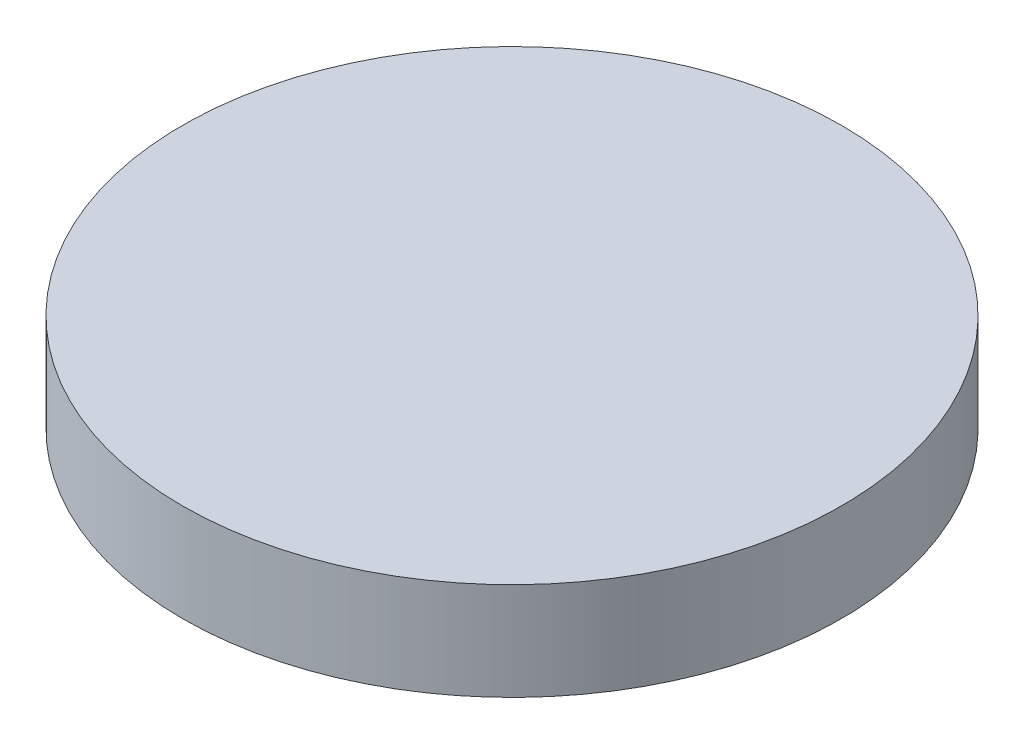
ISO-10303-21;
HEADER;
FILE_DESCRIPTION(('STEP AP214'),'2;1');
FILE_NAME('part.step','',(''),(''),'','','');
FILE_SCHEMA(('AUTOMOTIVE_DESIGN { 1 0 10303 214 1 1 1 1 }'));
ENDSEC;
DATA;
#1=APPLICATION_CONTEXT('core data for automotive mechanical design processes');
#2=APPLICATION_PROTOCOL_DEFINITION('international standard','automotive_design',2000,#1);
#3=PRODUCT_CONTEXT('',#1,'mechanical');
#4=PRODUCT('Part','Part','',(#3));
#5=PRODUCT_RELATED_PRODUCT_CATEGORY('part','',(#4));
#6=PRODUCT_DEFINITION_FORMATION('','',#4);
#7=PRODUCT_DEFINITION_CONTEXT('part definition',#1,'design');
#8=PRODUCT_DEFINITION('design','',#6,#7);
#9=PRODUCT_DEFINITION_SHAPE('','',#8);
#10=(LENGTH_UNIT() NAMED_UNIT(*) SI_UNIT(.MILLI.,.METRE.));
#11=(NAMED_UNIT(*) PLANE_ANGLE_UNIT() SI_UNIT($,.RADIAN.));
#12=(NAMED_UNIT(*) SI_UNIT($,.STERADIAN.) SOLID_ANGLE_UNIT());
#13=UNCERTAINTY_MEASURE_WITH_UNIT(LENGTH_MEASURE(1.E-05),#10,'distance_accuracy_value','');
#14=(GEOMETRIC_REPRESENTATION_CONTEXT(3) GLOBAL_UNCERTAINTY_ASSIGNED_CONTEXT((#13)) GLOBAL_UNIT_ASSIGNED_CONTEXT((#10,
#11,#12)) REPRESENTATION_CONTEXT('',''));
#15=CARTESIAN_POINT('',(0.,0.,0.));
#16=DIRECTION('',(0.,0.,1.));
#17=DIRECTION('',(1.,0.,0.));
#18=AXIS2_PLACEMENT_3D('',#15,#16,#17);
#19=CARTESIAN_POINT('',(0.,8.,0.));
#20=DIRECTION('',(0.,-1.,0.));
#21=DIRECTION('',(0.,0.,-1.));
#22=AXIS2_PLACEMENT_3D('',#19,#20,#21);
#23=CYLINDRICAL_SURFACE('',#22,27.);
#24=CARTESIAN_POINT('',(0.,8.,0.));
#25=DIRECTION('',(0.,1.,0.));
#26=DIRECTION('',(0.,0.,1.));
#27=AXIS2_PLACEMENT_3D('',#24,#25,#26);
#28=CIRCLE('',#27,27.);
#29=CARTESIAN_POINT('',(0.,8.,27.));
#30=VERTEX_POINT('',#29);
#31=EDGE_CURVE('E10',#30,#30,#28,.T.);
#32=ORIENTED_EDGE('',*,*,#31,.F.);
#33=EDGE_LOOP('',(#32));
#34=FACE_BOUND('',#33,.T.);
#35=CARTESIAN_POINT('',(0.,0.,0.));
#36=DIRECTION('',(0.,1.,0.));
#37=DIRECTION('',(0.,0.,1.));
#38=AXIS2_PLACEMENT_3D('',#35,#36,#37);
#39=CIRCLE('',#38,27.);
#40=CARTESIAN_POINT('',(0.,0.,27.));
#41=VERTEX_POINT('',#40);
#42=EDGE_CURVE('E46',#41,#41,#39,.T.);
#43=ORIENTED_EDGE('',*,*,#42,.T.);
#44=EDGE_LOOP('',(#43));
#45=FACE_BOUND('',#44,.T.);
#46=ADVANCED_FACE('F43',(#34,#45),#23,.T.);
#47=CARTESIAN_POINT('',(0.,8.,0.));
#48=DIRECTION('',(0.,1.,0.));
#49=DIRECTION('',(0.,0.,1.));
#50=AXIS2_PLACEMENT_3D('',#47,#48,#49);
#51=PLANE('',#50);
#52=ORIENTED_EDGE('',*,*,#31,.T.);
#53=EDGE_LOOP('',(#52));
#54=FACE_BOUND('',#53,.T.);
#55=ADVANCED_FACE('F60',(#54),#51,.T.);
#56=CARTESIAN_POINT('',(0.,0.,0.));
#57=DIRECTION('',(0.,1.,0.));
#58=DIRECTION('',(0.,0.,1.));
#59=AXIS2_PLACEMENT_3D('',#56,#57,#58);
#60=PLANE('',#59);
#61=ORIENTED_EDGE('',*,*,#42,.F.);
#62=EDGE_LOOP('',(#61));
#63=FACE_BOUND('',#62,.T.);
#64=ADVANCED_FACE('F58',(#63),#60,.F.);
#65=CLOSED_SHELL('',(#46,#55,#64));
#66=MANIFOLD_SOLID_BREP('B2',#65);
#67=ADVANCED_BREP_SHAPE_REPRESENTATION('',(#18,#66),#14);
#68=SHAPE_DEFINITION_REPRESENTATION(#9,#67);
ENDSEC;
END-ISO-10303-21;
